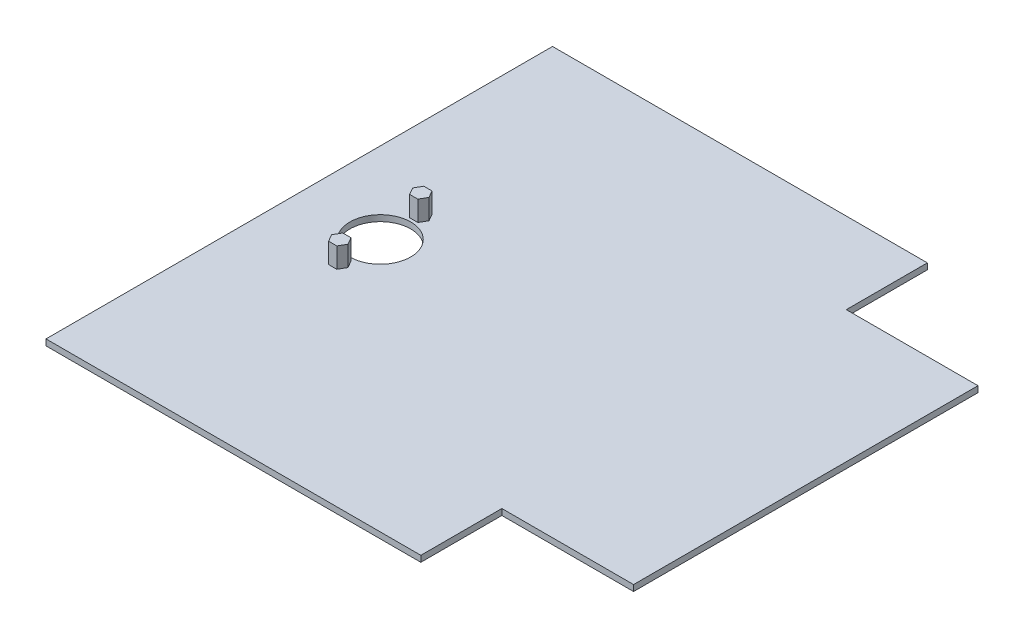
ISO-10303-21;
HEADER;
FILE_DESCRIPTION(('STEP AP214'),'2;1');
FILE_NAME('part.step','',(''),(''),'','','');
FILE_SCHEMA(('AUTOMOTIVE_DESIGN { 1 0 10303 214 1 1 1 1 }'));
ENDSEC;
DATA;
#1=APPLICATION_CONTEXT('core data for automotive mechanical design processes');
#2=APPLICATION_PROTOCOL_DEFINITION('international standard','automotive_design',2000,#1);
#3=PRODUCT_CONTEXT('',#1,'mechanical');
#4=PRODUCT('Part','Part','',(#3));
#5=PRODUCT_RELATED_PRODUCT_CATEGORY('part','',(#4));
#6=PRODUCT_DEFINITION_FORMATION('','',#4);
#7=PRODUCT_DEFINITION_CONTEXT('part definition',#1,'design');
#8=PRODUCT_DEFINITION('design','',#6,#7);
#9=PRODUCT_DEFINITION_SHAPE('','',#8);
#10=(LENGTH_UNIT() NAMED_UNIT(*) SI_UNIT(.MILLI.,.METRE.));
#11=(NAMED_UNIT(*) PLANE_ANGLE_UNIT() SI_UNIT($,.RADIAN.));
#12=(NAMED_UNIT(*) SI_UNIT($,.STERADIAN.) SOLID_ANGLE_UNIT());
#13=UNCERTAINTY_MEASURE_WITH_UNIT(LENGTH_MEASURE(1.E-05),#10,'distance_accuracy_value','');
#14=(GEOMETRIC_REPRESENTATION_CONTEXT(3) GLOBAL_UNCERTAINTY_ASSIGNED_CONTEXT((#13)) GLOBAL_UNIT_ASSIGNED_CONTEXT((#10,
#11,#12)) REPRESENTATION_CONTEXT('',''));
#15=CARTESIAN_POINT('',(0.,0.,0.));
#16=DIRECTION('',(0.,0.,1.));
#17=DIRECTION('',(1.,0.,0.));
#18=AXIS2_PLACEMENT_3D('',#15,#16,#17);
#19=CARTESIAN_POINT('',(0.,3.,0.));
#20=DIRECTION('',(0.,-1.,0.));
#21=DIRECTION('',(0.,0.,-1.));
#22=AXIS2_PLACEMENT_3D('',#19,#20,#21);
#23=PLANE('',#22);
#24=DIRECTION('',(0.499999999999999,0.,-0.866025403784439));
#25=VECTOR('',#24,1.);
#26=CARTESIAN_POINT('',(42.0207259421637,3.,-141.5));
#27=LINE('',#26,#25);
#28=CARTESIAN_POINT('',(42.0207259421637,3.,-141.5));
#29=VERTEX_POINT('',#28);
#30=CARTESIAN_POINT('',(44.0414518843274,3.,-145.));
#31=VERTEX_POINT('',#30);
#32=EDGE_CURVE('E191',#29,#31,#27,.T.);
#33=ORIENTED_EDGE('',*,*,#32,.F.);
#34=DIRECTION('',(1.,0.,0.));
#35=VECTOR('',#34,1.);
#36=CARTESIAN_POINT('',(37.9792740578363,3.,-141.5));
#37=LINE('',#36,#35);
#38=CARTESIAN_POINT('',(37.9792740578363,3.,-141.5));
#39=VERTEX_POINT('',#38);
#40=EDGE_CURVE('E204',#39,#29,#37,.T.);
#41=ORIENTED_EDGE('',*,*,#40,.F.);
#42=DIRECTION('',(0.499999999999999,0.,0.86602540378444));
#43=VECTOR('',#42,1.);
#44=CARTESIAN_POINT('',(35.9585481156726,3.,-145.));
#45=LINE('',#44,#43);
#46=CARTESIAN_POINT('',(35.9585481156726,3.,-145.));
#47=VERTEX_POINT('',#46);
#48=EDGE_CURVE('E223',#47,#39,#45,.T.);
#49=ORIENTED_EDGE('',*,*,#48,.F.);
#50=DIRECTION('',(-0.500000000000002,0.,0.866025403784438));
#51=VECTOR('',#50,1.);
#52=CARTESIAN_POINT('',(37.9792740578363,3.,-148.5));
#53=LINE('',#52,#51);
#54=CARTESIAN_POINT('',(37.9792740578363,3.,-148.5));
#55=VERTEX_POINT('',#54);
#56=EDGE_CURVE('E220',#55,#47,#53,.T.);
#57=ORIENTED_EDGE('',*,*,#56,.F.);
#58=DIRECTION('',(-1.,0.,0.));
#59=VECTOR('',#58,1.);
#60=CARTESIAN_POINT('',(42.0207259421637,3.,-148.5));
#61=LINE('',#60,#59);
#62=CARTESIAN_POINT('',(42.0207259421637,3.,-148.5));
#63=VERTEX_POINT('',#62);
#64=EDGE_CURVE('E217',#63,#55,#61,.T.);
#65=ORIENTED_EDGE('',*,*,#64,.F.);
#66=DIRECTION('',(-0.500000000000001,0.,-0.866025403784438));
#67=VECTOR('',#66,1.);
#68=CARTESIAN_POINT('',(44.0414518843274,3.,-145.));
#69=LINE('',#68,#67);
#70=EDGE_CURVE('E194',#31,#63,#69,.T.);
#71=ORIENTED_EDGE('',*,*,#70,.F.);
#72=EDGE_LOOP('',(#33,#41,#49,#57,#65,#71));
#73=FACE_BOUND('',#72,.T.);
#74=DIRECTION('',(0.,0.,1.));
#75=VECTOR('',#74,1.);
#76=CARTESIAN_POINT('',(0.,3.,0.));
#77=LINE('',#76,#75);
#78=CARTESIAN_POINT('',(0.,3.,-250.));
#79=VERTEX_POINT('',#78);
#80=CARTESIAN_POINT('',(0.,3.,0.));
#81=VERTEX_POINT('',#80);
#82=EDGE_CURVE('E252',#79,#81,#77,.T.);
#83=ORIENTED_EDGE('',*,*,#82,.T.);
#84=DIRECTION('',(1.,0.,0.));
#85=VECTOR('',#84,1.);
#86=CARTESIAN_POINT('',(0.,3.,0.));
#87=LINE('',#86,#85);
#88=CARTESIAN_POINT('',(185.,3.,0.));
#89=VERTEX_POINT('',#88);
#90=EDGE_CURVE('E255',#81,#89,#87,.T.);
#91=ORIENTED_EDGE('',*,*,#90,.T.);
#92=DIRECTION('',(0.,0.,-1.));
#93=VECTOR('',#92,1.);
#94=CARTESIAN_POINT('',(185.,3.,0.));
#95=LINE('',#94,#93);
#96=CARTESIAN_POINT('',(185.,3.,-40.));
#97=VERTEX_POINT('',#96);
#98=EDGE_CURVE('E258',#89,#97,#95,.T.);
#99=ORIENTED_EDGE('',*,*,#98,.T.);
#100=DIRECTION('',(1.,0.,0.));
#101=VECTOR('',#100,1.);
#102=CARTESIAN_POINT('',(185.,3.,-40.));
#103=LINE('',#102,#101);
#104=CARTESIAN_POINT('',(250.,3.,-40.));
#105=VERTEX_POINT('',#104);
#106=EDGE_CURVE('E260',#97,#105,#103,.T.);
#107=ORIENTED_EDGE('',*,*,#106,.T.);
#108=DIRECTION('',(0.,0.,-1.));
#109=VECTOR('',#108,1.);
#110=CARTESIAN_POINT('',(250.,3.,-40.));
#111=LINE('',#110,#109);
#112=CARTESIAN_POINT('',(250.,3.,-210.));
#113=VERTEX_POINT('',#112);
#114=EDGE_CURVE('E262',#105,#113,#111,.T.);
#115=ORIENTED_EDGE('',*,*,#114,.T.);
#116=DIRECTION('',(-1.,0.,0.));
#117=VECTOR('',#116,1.);
#118=CARTESIAN_POINT('',(250.,3.,-210.));
#119=LINE('',#118,#117);
#120=CARTESIAN_POINT('',(185.,3.,-210.));
#121=VERTEX_POINT('',#120);
#122=EDGE_CURVE('E264',#113,#121,#119,.T.);
#123=ORIENTED_EDGE('',*,*,#122,.T.);
#124=DIRECTION('',(0.,0.,-1.));
#125=VECTOR('',#124,1.);
#126=CARTESIAN_POINT('',(185.,3.,-250.));
#127=LINE('',#126,#125);
#128=CARTESIAN_POINT('',(185.,3.,-250.));
#129=VERTEX_POINT('',#128);
#130=EDGE_CURVE('E266',#121,#129,#127,.T.);
#131=ORIENTED_EDGE('',*,*,#130,.T.);
#132=DIRECTION('',(-1.,0.,0.));
#133=VECTOR('',#132,1.);
#134=CARTESIAN_POINT('',(0.,3.,-250.));
#135=LINE('',#134,#133);
#136=EDGE_CURVE('E268',#129,#79,#135,.T.);
#137=ORIENTED_EDGE('',*,*,#136,.T.);
#138=EDGE_LOOP('',(#83,#91,#99,#107,#115,#123,#131,#137));
#139=FACE_BOUND('',#138,.T.);
#140=CARTESIAN_POINT('',(40.,3.,-125.));
#141=DIRECTION('',(0.,1.,0.));
#142=DIRECTION('',(0.,0.,1.));
#143=AXIS2_PLACEMENT_3D('',#140,#141,#142);
#144=CIRCLE('',#143,15.);
#145=CARTESIAN_POINT('',(40.,3.,-110.));
#146=VERTEX_POINT('',#145);
#147=EDGE_CURVE('E246',#146,#146,#144,.T.);
#148=ORIENTED_EDGE('',*,*,#147,.F.);
#149=EDGE_LOOP('',(#148));
#150=FACE_BOUND('',#149,.T.);
#151=DIRECTION('',(0.500000000000001,0.,-0.866025403784438));
#152=VECTOR('',#151,1.);
#153=CARTESIAN_POINT('',(42.0207259421637,3.,-101.5));
#154=LINE('',#153,#152);
#155=CARTESIAN_POINT('',(42.0207259421637,3.,-101.5));
#156=VERTEX_POINT('',#155);
#157=CARTESIAN_POINT('',(44.0414518843274,3.,-105.));
#158=VERTEX_POINT('',#157);
#159=EDGE_CURVE('E190',#156,#158,#154,.T.);
#160=ORIENTED_EDGE('',*,*,#159,.F.);
#161=DIRECTION('',(1.,0.,0.));
#162=VECTOR('',#161,1.);
#163=CARTESIAN_POINT('',(37.9792740578364,3.,-101.5));
#164=LINE('',#163,#162);
#165=CARTESIAN_POINT('',(37.9792740578364,3.,-101.5));
#166=VERTEX_POINT('',#165);
#167=EDGE_CURVE('E187',#166,#156,#164,.T.);
#168=ORIENTED_EDGE('',*,*,#167,.F.);
#169=DIRECTION('',(0.5,0.,0.866025403784439));
#170=VECTOR('',#169,1.);
#171=CARTESIAN_POINT('',(35.9585481156727,3.,-105.));
#172=LINE('',#171,#170);
#173=CARTESIAN_POINT('',(35.9585481156727,3.,-105.));
#174=VERTEX_POINT('',#173);
#175=EDGE_CURVE('E387',#174,#166,#172,.T.);
#176=ORIENTED_EDGE('',*,*,#175,.F.);
#177=DIRECTION('',(-0.499999999999999,0.,0.866025403784439));
#178=VECTOR('',#177,1.);
#179=CARTESIAN_POINT('',(37.9792740578364,3.,-108.5));
#180=LINE('',#179,#178);
#181=CARTESIAN_POINT('',(37.9792740578364,3.,-108.5));
#182=VERTEX_POINT('',#181);
#183=EDGE_CURVE('E404',#182,#174,#180,.T.);
#184=ORIENTED_EDGE('',*,*,#183,.F.);
#185=DIRECTION('',(-1.,0.,0.));
#186=VECTOR('',#185,1.);
#187=CARTESIAN_POINT('',(42.0207259421637,3.,-108.5));
#188=LINE('',#187,#186);
#189=CARTESIAN_POINT('',(42.0207259421637,3.,-108.5));
#190=VERTEX_POINT('',#189);
#191=EDGE_CURVE('E53',#190,#182,#188,.T.);
#192=ORIENTED_EDGE('',*,*,#191,.F.);
#193=DIRECTION('',(-0.499999999999999,0.,-0.866025403784439));
#194=VECTOR('',#193,1.);
#195=CARTESIAN_POINT('',(44.0414518843274,3.,-105.));
#196=LINE('',#195,#194);
#197=EDGE_CURVE('E48',#158,#190,#196,.T.);
#198=ORIENTED_EDGE('',*,*,#197,.F.);
#199=EDGE_LOOP('',(#160,#168,#176,#184,#192,#198));
#200=FACE_BOUND('',#199,.T.);
#201=ADVANCED_FACE('F33',(#73,#139,#150,#200),#23,.F.);
#202=CARTESIAN_POINT('',(0.,0.,0.));
#203=DIRECTION('',(0.,-1.,0.));
#204=DIRECTION('',(0.,0.,-1.));
#205=AXIS2_PLACEMENT_3D('',#202,#203,#204);
#206=PLANE('',#205);
#207=DIRECTION('',(0.,0.,1.));
#208=VECTOR('',#207,1.);
#209=CARTESIAN_POINT('',(0.,0.,0.));
#210=LINE('',#209,#208);
#211=CARTESIAN_POINT('',(0.,0.,-250.));
#212=VERTEX_POINT('',#211);
#213=CARTESIAN_POINT('',(0.,0.,0.));
#214=VERTEX_POINT('',#213);
#215=EDGE_CURVE('E249',#212,#214,#210,.T.);
#216=ORIENTED_EDGE('',*,*,#215,.F.);
#217=DIRECTION('',(-1.,0.,0.));
#218=VECTOR('',#217,1.);
#219=CARTESIAN_POINT('',(0.,0.,-250.));
#220=LINE('',#219,#218);
#221=CARTESIAN_POINT('',(185.,0.,-250.));
#222=VERTEX_POINT('',#221);
#223=EDGE_CURVE('E256',#222,#212,#220,.T.);
#224=ORIENTED_EDGE('',*,*,#223,.F.);
#225=DIRECTION('',(0.,0.,-1.));
#226=VECTOR('',#225,1.);
#227=CARTESIAN_POINT('',(185.,0.,-250.));
#228=LINE('',#227,#226);
#229=CARTESIAN_POINT('',(185.,0.,-210.));
#230=VERTEX_POINT('',#229);
#231=EDGE_CURVE('E283',#230,#222,#228,.T.);
#232=ORIENTED_EDGE('',*,*,#231,.F.);
#233=DIRECTION('',(-1.,0.,0.));
#234=VECTOR('',#233,1.);
#235=CARTESIAN_POINT('',(250.,0.,-210.));
#236=LINE('',#235,#234);
#237=CARTESIAN_POINT('',(250.,0.,-210.));
#238=VERTEX_POINT('',#237);
#239=EDGE_CURVE('E281',#238,#230,#236,.T.);
#240=ORIENTED_EDGE('',*,*,#239,.F.);
#241=DIRECTION('',(0.,0.,-1.));
#242=VECTOR('',#241,1.);
#243=CARTESIAN_POINT('',(250.,0.,-40.));
#244=LINE('',#243,#242);
#245=CARTESIAN_POINT('',(250.,0.,-40.));
#246=VERTEX_POINT('',#245);
#247=EDGE_CURVE('E279',#246,#238,#244,.T.);
#248=ORIENTED_EDGE('',*,*,#247,.F.);
#249=DIRECTION('',(1.,0.,0.));
#250=VECTOR('',#249,1.);
#251=CARTESIAN_POINT('',(185.,0.,-40.));
#252=LINE('',#251,#250);
#253=CARTESIAN_POINT('',(185.,0.,-40.));
#254=VERTEX_POINT('',#253);
#255=EDGE_CURVE('E277',#254,#246,#252,.T.);
#256=ORIENTED_EDGE('',*,*,#255,.F.);
#257=DIRECTION('',(0.,0.,-1.));
#258=VECTOR('',#257,1.);
#259=CARTESIAN_POINT('',(185.,0.,0.));
#260=LINE('',#259,#258);
#261=CARTESIAN_POINT('',(185.,0.,0.));
#262=VERTEX_POINT('',#261);
#263=EDGE_CURVE('E275',#262,#254,#260,.T.);
#264=ORIENTED_EDGE('',*,*,#263,.F.);
#265=DIRECTION('',(1.,0.,0.));
#266=VECTOR('',#265,1.);
#267=CARTESIAN_POINT('',(0.,0.,0.));
#268=LINE('',#267,#266);
#269=EDGE_CURVE('E273',#214,#262,#268,.T.);
#270=ORIENTED_EDGE('',*,*,#269,.F.);
#271=EDGE_LOOP('',(#216,#224,#232,#240,#248,#256,#264,#270));
#272=FACE_BOUND('',#271,.T.);
#273=CARTESIAN_POINT('',(40.,0.,-125.));
#274=DIRECTION('',(0.,1.,0.));
#275=DIRECTION('',(0.,0.,1.));
#276=AXIS2_PLACEMENT_3D('',#273,#274,#275);
#277=CIRCLE('',#276,15.);
#278=CARTESIAN_POINT('',(40.,0.,-110.));
#279=VERTEX_POINT('',#278);
#280=EDGE_CURVE('E245',#279,#279,#277,.T.);
#281=ORIENTED_EDGE('',*,*,#280,.T.);
#282=EDGE_LOOP('',(#281));
#283=FACE_BOUND('',#282,.T.);
#284=ADVANCED_FACE('F313',(#272,#283),#206,.T.);
#285=CARTESIAN_POINT('',(0.,3.,0.));
#286=DIRECTION('',(1.,0.,0.));
#287=DIRECTION('',(0.,0.,-1.));
#288=AXIS2_PLACEMENT_3D('',#285,#286,#287);
#289=PLANE('',#288);
#290=ORIENTED_EDGE('',*,*,#215,.T.);
#291=DIRECTION('',(0.,-1.,0.));
#292=VECTOR('',#291,1.);
#293=CARTESIAN_POINT('',(0.,3.,0.));
#294=LINE('',#293,#292);
#295=EDGE_CURVE('E11',#81,#214,#294,.T.);
#296=ORIENTED_EDGE('',*,*,#295,.F.);
#297=ORIENTED_EDGE('',*,*,#82,.F.);
#298=DIRECTION('',(0.,-1.,0.));
#299=VECTOR('',#298,1.);
#300=CARTESIAN_POINT('',(0.,3.,-250.));
#301=LINE('',#300,#299);
#302=EDGE_CURVE('E270',#79,#212,#301,.T.);
#303=ORIENTED_EDGE('',*,*,#302,.T.);
#304=EDGE_LOOP('',(#290,#296,#297,#303));
#305=FACE_BOUND('',#304,.T.);
#306=ADVANCED_FACE('F35',(#305),#289,.F.);
#307=CARTESIAN_POINT('',(0.,3.,0.));
#308=DIRECTION('',(0.,0.,-1.));
#309=DIRECTION('',(-1.,0.,0.));
#310=AXIS2_PLACEMENT_3D('',#307,#308,#309);
#311=PLANE('',#310);
#312=ORIENTED_EDGE('',*,*,#269,.T.);
#313=DIRECTION('',(0.,-1.,0.));
#314=VECTOR('',#313,1.);
#315=CARTESIAN_POINT('',(185.,3.,0.));
#316=LINE('',#315,#314);
#317=EDGE_CURVE('E41',#89,#262,#316,.T.);
#318=ORIENTED_EDGE('',*,*,#317,.F.);
#319=ORIENTED_EDGE('',*,*,#90,.F.);
#320=ORIENTED_EDGE('',*,*,#295,.T.);
#321=EDGE_LOOP('',(#312,#318,#319,#320));
#322=FACE_BOUND('',#321,.T.);
#323=ADVANCED_FACE('F331',(#322),#311,.F.);
#324=CARTESIAN_POINT('',(185.,3.,0.));
#325=DIRECTION('',(-1.,0.,0.));
#326=DIRECTION('',(0.,0.,1.));
#327=AXIS2_PLACEMENT_3D('',#324,#325,#326);
#328=PLANE('',#327);
#329=ORIENTED_EDGE('',*,*,#263,.T.);
#330=DIRECTION('',(0.,-1.,0.));
#331=VECTOR('',#330,1.);
#332=CARTESIAN_POINT('',(185.,3.,-40.));
#333=LINE('',#332,#331);
#334=EDGE_CURVE('E300',#97,#254,#333,.T.);
#335=ORIENTED_EDGE('',*,*,#334,.F.);
#336=ORIENTED_EDGE('',*,*,#98,.F.);
#337=ORIENTED_EDGE('',*,*,#317,.T.);
#338=EDGE_LOOP('',(#329,#335,#336,#337));
#339=FACE_BOUND('',#338,.T.);
#340=ADVANCED_FACE('F307',(#339),#328,.F.);
#341=CARTESIAN_POINT('',(185.,3.,-40.));
#342=DIRECTION('',(0.,0.,-1.));
#343=DIRECTION('',(-1.,0.,0.));
#344=AXIS2_PLACEMENT_3D('',#341,#342,#343);
#345=PLANE('',#344);
#346=ORIENTED_EDGE('',*,*,#255,.T.);
#347=DIRECTION('',(0.,-1.,0.));
#348=VECTOR('',#347,1.);
#349=CARTESIAN_POINT('',(250.,3.,-40.));
#350=LINE('',#349,#348);
#351=EDGE_CURVE('E297',#105,#246,#350,.T.);
#352=ORIENTED_EDGE('',*,*,#351,.F.);
#353=ORIENTED_EDGE('',*,*,#106,.F.);
#354=ORIENTED_EDGE('',*,*,#334,.T.);
#355=EDGE_LOOP('',(#346,#352,#353,#354));
#356=FACE_BOUND('',#355,.T.);
#357=ADVANCED_FACE('F319',(#356),#345,.F.);
#358=CARTESIAN_POINT('',(250.,3.,-40.));
#359=DIRECTION('',(-1.,0.,0.));
#360=DIRECTION('',(0.,0.,1.));
#361=AXIS2_PLACEMENT_3D('',#358,#359,#360);
#362=PLANE('',#361);
#363=ORIENTED_EDGE('',*,*,#247,.T.);
#364=DIRECTION('',(0.,-1.,0.));
#365=VECTOR('',#364,1.);
#366=CARTESIAN_POINT('',(250.,3.,-210.));
#367=LINE('',#366,#365);
#368=EDGE_CURVE('E294',#113,#238,#367,.T.);
#369=ORIENTED_EDGE('',*,*,#368,.F.);
#370=ORIENTED_EDGE('',*,*,#114,.F.);
#371=ORIENTED_EDGE('',*,*,#351,.T.);
#372=EDGE_LOOP('',(#363,#369,#370,#371));
#373=FACE_BOUND('',#372,.T.);
#374=ADVANCED_FACE('F323',(#373),#362,.F.);
#375=CARTESIAN_POINT('',(250.,3.,-210.));
#376=DIRECTION('',(0.,0.,1.));
#377=DIRECTION('',(1.,0.,0.));
#378=AXIS2_PLACEMENT_3D('',#375,#376,#377);
#379=PLANE('',#378);
#380=ORIENTED_EDGE('',*,*,#239,.T.);
#381=DIRECTION('',(0.,-1.,0.));
#382=VECTOR('',#381,1.);
#383=CARTESIAN_POINT('',(185.,3.,-210.));
#384=LINE('',#383,#382);
#385=EDGE_CURVE('E291',#121,#230,#384,.T.);
#386=ORIENTED_EDGE('',*,*,#385,.F.);
#387=ORIENTED_EDGE('',*,*,#122,.F.);
#388=ORIENTED_EDGE('',*,*,#368,.T.);
#389=EDGE_LOOP('',(#380,#386,#387,#388));
#390=FACE_BOUND('',#389,.T.);
#391=ADVANCED_FACE('F344',(#390),#379,.F.);
#392=CARTESIAN_POINT('',(185.,3.,-250.));
#393=DIRECTION('',(-1.,0.,0.));
#394=DIRECTION('',(0.,0.,1.));
#395=AXIS2_PLACEMENT_3D('',#392,#393,#394);
#396=PLANE('',#395);
#397=ORIENTED_EDGE('',*,*,#231,.T.);
#398=DIRECTION('',(0.,-1.,0.));
#399=VECTOR('',#398,1.);
#400=CARTESIAN_POINT('',(185.,3.,-250.));
#401=LINE('',#400,#399);
#402=EDGE_CURVE('E288',#129,#222,#401,.T.);
#403=ORIENTED_EDGE('',*,*,#402,.F.);
#404=ORIENTED_EDGE('',*,*,#130,.F.);
#405=ORIENTED_EDGE('',*,*,#385,.T.);
#406=EDGE_LOOP('',(#397,#403,#404,#405));
#407=FACE_BOUND('',#406,.T.);
#408=ADVANCED_FACE('F342',(#407),#396,.F.);
#409=CARTESIAN_POINT('',(0.,3.,-250.));
#410=DIRECTION('',(0.,0.,1.));
#411=DIRECTION('',(1.,0.,0.));
#412=AXIS2_PLACEMENT_3D('',#409,#410,#411);
#413=PLANE('',#412);
#414=ORIENTED_EDGE('',*,*,#223,.T.);
#415=ORIENTED_EDGE('',*,*,#302,.F.);
#416=ORIENTED_EDGE('',*,*,#136,.F.);
#417=ORIENTED_EDGE('',*,*,#402,.T.);
#418=EDGE_LOOP('',(#414,#415,#416,#417));
#419=FACE_BOUND('',#418,.T.);
#420=ADVANCED_FACE('F337',(#419),#413,.F.);
#421=CARTESIAN_POINT('',(40.,3.,-125.));
#422=DIRECTION('',(0.,-1.,0.));
#423=DIRECTION('',(0.,0.,-1.));
#424=AXIS2_PLACEMENT_3D('',#421,#422,#423);
#425=CYLINDRICAL_SURFACE('',#424,15.);
#426=ORIENTED_EDGE('',*,*,#147,.T.);
#427=EDGE_LOOP('',(#426));
#428=FACE_BOUND('',#427,.T.);
#429=ORIENTED_EDGE('',*,*,#280,.F.);
#430=EDGE_LOOP('',(#429));
#431=FACE_BOUND('',#430,.T.);
#432=ADVANCED_FACE('F361',(#428,#431),#425,.F.);
#433=CARTESIAN_POINT('',(42.0207259421637,13.,-141.5));
#434=DIRECTION('',(-0.866025403784439,0.,-0.499999999999999));
#435=DIRECTION('',(-0.499999999999999,0.,0.866025403784439));
#436=AXIS2_PLACEMENT_3D('',#433,#434,#435);
#437=PLANE('',#436);
#438=ORIENTED_EDGE('',*,*,#32,.T.);
#439=DIRECTION('',(0.,-1.,0.));
#440=VECTOR('',#439,1.);
#441=CARTESIAN_POINT('',(44.0414518843274,13.,-145.));
#442=LINE('',#441,#440);
#443=CARTESIAN_POINT('',(44.0414518843274,13.,-145.));
#444=VERTEX_POINT('',#443);
#445=EDGE_CURVE('E242',#444,#31,#442,.T.);
#446=ORIENTED_EDGE('',*,*,#445,.F.);
#447=DIRECTION('',(0.499999999999999,0.,-0.866025403784439));
#448=VECTOR('',#447,1.);
#449=CARTESIAN_POINT('',(42.0207259421637,13.,-141.5));
#450=LINE('',#449,#448);
#451=CARTESIAN_POINT('',(42.0207259421637,13.,-141.5));
#452=VERTEX_POINT('',#451);
#453=EDGE_CURVE('E200',#452,#444,#450,.T.);
#454=ORIENTED_EDGE('',*,*,#453,.F.);
#455=DIRECTION('',(0.,-1.,0.));
#456=VECTOR('',#455,1.);
#457=CARTESIAN_POINT('',(42.0207259421637,13.,-141.5));
#458=LINE('',#457,#456);
#459=EDGE_CURVE('E213',#452,#29,#458,.T.);
#460=ORIENTED_EDGE('',*,*,#459,.T.);
#461=EDGE_LOOP('',(#438,#446,#454,#460));
#462=FACE_BOUND('',#461,.T.);
#463=ADVANCED_FACE('F368',(#462),#437,.F.);
#464=CARTESIAN_POINT('',(44.0414518843274,13.,-145.));
#465=DIRECTION('',(-0.866025403784438,0.,0.500000000000001));
#466=DIRECTION('',(0.500000000000001,0.,0.866025403784438));
#467=AXIS2_PLACEMENT_3D('',#464,#465,#466);
#468=PLANE('',#467);
#469=ORIENTED_EDGE('',*,*,#70,.T.);
#470=DIRECTION('',(0.,-1.,0.));
#471=VECTOR('',#470,1.);
#472=CARTESIAN_POINT('',(42.0207259421637,13.,-148.5));
#473=LINE('',#472,#471);
#474=CARTESIAN_POINT('',(42.0207259421637,13.,-148.5));
#475=VERTEX_POINT('',#474);
#476=EDGE_CURVE('E239',#475,#63,#473,.T.);
#477=ORIENTED_EDGE('',*,*,#476,.F.);
#478=DIRECTION('',(-0.500000000000001,0.,-0.866025403784438));
#479=VECTOR('',#478,1.);
#480=CARTESIAN_POINT('',(44.0414518843274,13.,-145.));
#481=LINE('',#480,#479);
#482=EDGE_CURVE('E203',#444,#475,#481,.T.);
#483=ORIENTED_EDGE('',*,*,#482,.F.);
#484=ORIENTED_EDGE('',*,*,#445,.T.);
#485=EDGE_LOOP('',(#469,#477,#483,#484));
#486=FACE_BOUND('',#485,.T.);
#487=ADVANCED_FACE('F373',(#486),#468,.F.);
#488=CARTESIAN_POINT('',(42.0207259421637,13.,-148.5));
#489=DIRECTION('',(0.,0.,1.));
#490=DIRECTION('',(1.,0.,0.));
#491=AXIS2_PLACEMENT_3D('',#488,#489,#490);
#492=PLANE('',#491);
#493=ORIENTED_EDGE('',*,*,#64,.T.);
#494=DIRECTION('',(0.,-1.,0.));
#495=VECTOR('',#494,1.);
#496=CARTESIAN_POINT('',(37.9792740578363,13.,-148.5));
#497=LINE('',#496,#495);
#498=CARTESIAN_POINT('',(37.9792740578363,13.,-148.5));
#499=VERTEX_POINT('',#498);
#500=EDGE_CURVE('E236',#499,#55,#497,.T.);
#501=ORIENTED_EDGE('',*,*,#500,.F.);
#502=DIRECTION('',(-1.,0.,0.));
#503=VECTOR('',#502,1.);
#504=CARTESIAN_POINT('',(42.0207259421637,13.,-148.5));
#505=LINE('',#504,#503);
#506=EDGE_CURVE('E206',#475,#499,#505,.T.);
#507=ORIENTED_EDGE('',*,*,#506,.F.);
#508=ORIENTED_EDGE('',*,*,#476,.T.);
#509=EDGE_LOOP('',(#493,#501,#507,#508));
#510=FACE_BOUND('',#509,.T.);
#511=ADVANCED_FACE('F448',(#510),#492,.F.);
#512=CARTESIAN_POINT('',(37.9792740578363,13.,-148.5));
#513=DIRECTION('',(0.866025403784438,0.,0.500000000000002));
#514=DIRECTION('',(0.500000000000002,0.,-0.866025403784438));
#515=AXIS2_PLACEMENT_3D('',#512,#513,#514);
#516=PLANE('',#515);
#517=ORIENTED_EDGE('',*,*,#56,.T.);
#518=DIRECTION('',(0.,-1.,0.));
#519=VECTOR('',#518,1.);
#520=CARTESIAN_POINT('',(35.9585481156726,13.,-145.));
#521=LINE('',#520,#519);
#522=CARTESIAN_POINT('',(35.9585481156726,13.,-145.));
#523=VERTEX_POINT('',#522);
#524=EDGE_CURVE('E233',#523,#47,#521,.T.);
#525=ORIENTED_EDGE('',*,*,#524,.F.);
#526=DIRECTION('',(-0.500000000000002,0.,0.866025403784438));
#527=VECTOR('',#526,1.);
#528=CARTESIAN_POINT('',(37.9792740578363,13.,-148.5));
#529=LINE('',#528,#527);
#530=EDGE_CURVE('E208',#499,#523,#529,.T.);
#531=ORIENTED_EDGE('',*,*,#530,.F.);
#532=ORIENTED_EDGE('',*,*,#500,.T.);
#533=EDGE_LOOP('',(#517,#525,#531,#532));
#534=FACE_BOUND('',#533,.T.);
#535=ADVANCED_FACE('F444',(#534),#516,.F.);
#536=CARTESIAN_POINT('',(35.9585481156726,13.,-145.));
#537=DIRECTION('',(0.86602540378444,0.,-0.499999999999998));
#538=DIRECTION('',(-0.499999999999998,0.,-0.86602540378444));
#539=AXIS2_PLACEMENT_3D('',#536,#537,#538);
#540=PLANE('',#539);
#541=ORIENTED_EDGE('',*,*,#48,.T.);
#542=DIRECTION('',(0.,-1.,0.));
#543=VECTOR('',#542,1.);
#544=CARTESIAN_POINT('',(37.9792740578363,13.,-141.5));
#545=LINE('',#544,#543);
#546=CARTESIAN_POINT('',(37.9792740578363,13.,-141.5));
#547=VERTEX_POINT('',#546);
#548=EDGE_CURVE('E230',#547,#39,#545,.T.);
#549=ORIENTED_EDGE('',*,*,#548,.F.);
#550=DIRECTION('',(0.499999999999999,0.,0.86602540378444));
#551=VECTOR('',#550,1.);
#552=CARTESIAN_POINT('',(35.9585481156726,13.,-145.));
#553=LINE('',#552,#551);
#554=EDGE_CURVE('E210',#523,#547,#553,.T.);
#555=ORIENTED_EDGE('',*,*,#554,.F.);
#556=ORIENTED_EDGE('',*,*,#524,.T.);
#557=EDGE_LOOP('',(#541,#549,#555,#556));
#558=FACE_BOUND('',#557,.T.);
#559=ADVANCED_FACE('F440',(#558),#540,.F.);
#560=CARTESIAN_POINT('',(37.9792740578363,13.,-141.5));
#561=DIRECTION('',(0.,0.,-1.));
#562=DIRECTION('',(-1.,0.,0.));
#563=AXIS2_PLACEMENT_3D('',#560,#561,#562);
#564=PLANE('',#563);
#565=ORIENTED_EDGE('',*,*,#40,.T.);
#566=ORIENTED_EDGE('',*,*,#459,.F.);
#567=DIRECTION('',(1.,0.,0.));
#568=VECTOR('',#567,1.);
#569=CARTESIAN_POINT('',(37.9792740578363,13.,-141.5));
#570=LINE('',#569,#568);
#571=EDGE_CURVE('E212',#547,#452,#570,.T.);
#572=ORIENTED_EDGE('',*,*,#571,.F.);
#573=ORIENTED_EDGE('',*,*,#548,.T.);
#574=EDGE_LOOP('',(#565,#566,#572,#573));
#575=FACE_BOUND('',#574,.T.);
#576=ADVANCED_FACE('F436',(#575),#564,.F.);
#577=CARTESIAN_POINT('',(0.,13.,0.));
#578=DIRECTION('',(0.,1.,0.));
#579=DIRECTION('',(0.,0.,1.));
#580=AXIS2_PLACEMENT_3D('',#577,#578,#579);
#581=PLANE('',#580);
#582=ORIENTED_EDGE('',*,*,#453,.T.);
#583=ORIENTED_EDGE('',*,*,#482,.T.);
#584=ORIENTED_EDGE('',*,*,#506,.T.);
#585=ORIENTED_EDGE('',*,*,#530,.T.);
#586=ORIENTED_EDGE('',*,*,#554,.T.);
#587=ORIENTED_EDGE('',*,*,#571,.T.);
#588=EDGE_LOOP('',(#582,#583,#584,#585,#586,#587));
#589=FACE_BOUND('',#588,.T.);
#590=ADVANCED_FACE('F433',(#589),#581,.T.);
#591=CARTESIAN_POINT('',(42.0207259421637,13.,-101.5));
#592=DIRECTION('',(-0.866025403784438,0.,-0.500000000000001));
#593=DIRECTION('',(-0.500000000000001,0.,0.866025403784438));
#594=AXIS2_PLACEMENT_3D('',#591,#592,#593);
#595=PLANE('',#594);
#596=ORIENTED_EDGE('',*,*,#159,.T.);
#597=DIRECTION('',(0.,-1.,0.));
#598=VECTOR('',#597,1.);
#599=CARTESIAN_POINT('',(44.0414518843274,13.,-105.));
#600=LINE('',#599,#598);
#601=CARTESIAN_POINT('',(44.0414518843274,13.,-105.));
#602=VERTEX_POINT('',#601);
#603=EDGE_CURVE('E171',#602,#158,#600,.T.);
#604=ORIENTED_EDGE('',*,*,#603,.F.);
#605=DIRECTION('',(0.500000000000001,0.,-0.866025403784438));
#606=VECTOR('',#605,1.);
#607=CARTESIAN_POINT('',(42.0207259421637,13.,-101.5));
#608=LINE('',#607,#606);
#609=CARTESIAN_POINT('',(42.0207259421637,13.,-101.5));
#610=VERTEX_POINT('',#609);
#611=EDGE_CURVE('E178',#610,#602,#608,.T.);
#612=ORIENTED_EDGE('',*,*,#611,.F.);
#613=DIRECTION('',(0.,-1.,0.));
#614=VECTOR('',#613,1.);
#615=CARTESIAN_POINT('',(42.0207259421637,13.,-101.5));
#616=LINE('',#615,#614);
#617=EDGE_CURVE('E384',#610,#156,#616,.T.);
#618=ORIENTED_EDGE('',*,*,#617,.T.);
#619=EDGE_LOOP('',(#596,#604,#612,#618));
#620=FACE_BOUND('',#619,.T.);
#621=ADVANCED_FACE('F189',(#620),#595,.F.);
#622=CARTESIAN_POINT('',(44.0414518843274,13.,-105.));
#623=DIRECTION('',(-0.866025403784439,0.,0.499999999999999));
#624=DIRECTION('',(0.499999999999999,0.,0.866025403784439));
#625=AXIS2_PLACEMENT_3D('',#622,#623,#624);
#626=PLANE('',#625);
#627=ORIENTED_EDGE('',*,*,#197,.T.);
#628=DIRECTION('',(0.,-1.,0.));
#629=VECTOR('',#628,1.);
#630=CARTESIAN_POINT('',(42.0207259421637,13.,-108.5));
#631=LINE('',#630,#629);
#632=CARTESIAN_POINT('',(42.0207259421637,13.,-108.5));
#633=VERTEX_POINT('',#632);
#634=EDGE_CURVE('E174',#633,#190,#631,.T.);
#635=ORIENTED_EDGE('',*,*,#634,.F.);
#636=DIRECTION('',(-0.499999999999999,0.,-0.866025403784439));
#637=VECTOR('',#636,1.);
#638=CARTESIAN_POINT('',(44.0414518843274,13.,-105.));
#639=LINE('',#638,#637);
#640=EDGE_CURVE('E167',#602,#633,#639,.T.);
#641=ORIENTED_EDGE('',*,*,#640,.F.);
#642=ORIENTED_EDGE('',*,*,#603,.T.);
#643=EDGE_LOOP('',(#627,#635,#641,#642));
#644=FACE_BOUND('',#643,.T.);
#645=ADVANCED_FACE('F169',(#644),#626,.F.);
#646=CARTESIAN_POINT('',(42.0207259421637,13.,-108.5));
#647=DIRECTION('',(0.,0.,1.));
#648=DIRECTION('',(1.,0.,0.));
#649=AXIS2_PLACEMENT_3D('',#646,#647,#648);
#650=PLANE('',#649);
#651=ORIENTED_EDGE('',*,*,#191,.T.);
#652=DIRECTION('',(0.,-1.,0.));
#653=VECTOR('',#652,1.);
#654=CARTESIAN_POINT('',(37.9792740578364,13.,-108.5));
#655=LINE('',#654,#653);
#656=CARTESIAN_POINT('',(37.9792740578364,13.,-108.5));
#657=VERTEX_POINT('',#656);
#658=EDGE_CURVE('E196',#657,#182,#655,.T.);
#659=ORIENTED_EDGE('',*,*,#658,.F.);
#660=DIRECTION('',(-1.,0.,0.));
#661=VECTOR('',#660,1.);
#662=CARTESIAN_POINT('',(42.0207259421637,13.,-108.5));
#663=LINE('',#662,#661);
#664=EDGE_CURVE('E177',#633,#657,#663,.T.);
#665=ORIENTED_EDGE('',*,*,#664,.F.);
#666=ORIENTED_EDGE('',*,*,#634,.T.);
#667=EDGE_LOOP('',(#651,#659,#665,#666));
#668=FACE_BOUND('',#667,.T.);
#669=ADVANCED_FACE('F407',(#668),#650,.F.);
#670=CARTESIAN_POINT('',(37.9792740578364,13.,-108.5));
#671=DIRECTION('',(0.866025403784439,0.,0.499999999999999));
#672=DIRECTION('',(0.499999999999999,0.,-0.866025403784439));
#673=AXIS2_PLACEMENT_3D('',#670,#671,#672);
#674=PLANE('',#673);
#675=ORIENTED_EDGE('',*,*,#183,.T.);
#676=DIRECTION('',(0.,-1.,0.));
#677=VECTOR('',#676,1.);
#678=CARTESIAN_POINT('',(35.9585481156727,13.,-105.));
#679=LINE('',#678,#677);
#680=CARTESIAN_POINT('',(35.9585481156727,13.,-105.));
#681=VERTEX_POINT('',#680);
#682=EDGE_CURVE('E390',#681,#174,#679,.T.);
#683=ORIENTED_EDGE('',*,*,#682,.F.);
#684=DIRECTION('',(-0.499999999999999,0.,0.866025403784439));
#685=VECTOR('',#684,1.);
#686=CARTESIAN_POINT('',(37.9792740578364,13.,-108.5));
#687=LINE('',#686,#685);
#688=EDGE_CURVE('E405',#657,#681,#687,.T.);
#689=ORIENTED_EDGE('',*,*,#688,.F.);
#690=ORIENTED_EDGE('',*,*,#658,.T.);
#691=EDGE_LOOP('',(#675,#683,#689,#690));
#692=FACE_BOUND('',#691,.T.);
#693=ADVANCED_FACE('F402',(#692),#674,.F.);
#694=CARTESIAN_POINT('',(35.9585481156727,13.,-105.));
#695=DIRECTION('',(0.866025403784439,0.,-0.5));
#696=DIRECTION('',(-0.5,0.,-0.866025403784439));
#697=AXIS2_PLACEMENT_3D('',#694,#695,#696);
#698=PLANE('',#697);
#699=ORIENTED_EDGE('',*,*,#175,.T.);
#700=DIRECTION('',(0.,-1.,0.));
#701=VECTOR('',#700,1.);
#702=CARTESIAN_POINT('',(37.9792740578364,13.,-101.5));
#703=LINE('',#702,#701);
#704=CARTESIAN_POINT('',(37.9792740578364,13.,-101.5));
#705=VERTEX_POINT('',#704);
#706=EDGE_CURVE('E386',#705,#166,#703,.T.);
#707=ORIENTED_EDGE('',*,*,#706,.F.);
#708=DIRECTION('',(0.5,0.,0.866025403784439));
#709=VECTOR('',#708,1.);
#710=CARTESIAN_POINT('',(35.9585481156727,13.,-105.));
#711=LINE('',#710,#709);
#712=EDGE_CURVE('E392',#681,#705,#711,.T.);
#713=ORIENTED_EDGE('',*,*,#712,.F.);
#714=ORIENTED_EDGE('',*,*,#682,.T.);
#715=EDGE_LOOP('',(#699,#707,#713,#714));
#716=FACE_BOUND('',#715,.T.);
#717=ADVANCED_FACE('F412',(#716),#698,.F.);
#718=CARTESIAN_POINT('',(37.9792740578364,13.,-101.5));
#719=DIRECTION('',(0.,0.,-1.));
#720=DIRECTION('',(-1.,0.,0.));
#721=AXIS2_PLACEMENT_3D('',#718,#719,#720);
#722=PLANE('',#721);
#723=ORIENTED_EDGE('',*,*,#167,.T.);
#724=ORIENTED_EDGE('',*,*,#617,.F.);
#725=DIRECTION('',(1.,0.,0.));
#726=VECTOR('',#725,1.);
#727=CARTESIAN_POINT('',(37.9792740578364,13.,-101.5));
#728=LINE('',#727,#726);
#729=EDGE_CURVE('E183',#705,#610,#728,.T.);
#730=ORIENTED_EDGE('',*,*,#729,.F.);
#731=ORIENTED_EDGE('',*,*,#706,.T.);
#732=EDGE_LOOP('',(#723,#724,#730,#731));
#733=FACE_BOUND('',#732,.T.);
#734=ADVANCED_FACE('F383',(#733),#722,.F.);
#735=CARTESIAN_POINT('',(0.,13.,0.));
#736=DIRECTION('',(0.,1.,0.));
#737=DIRECTION('',(0.,0.,1.));
#738=AXIS2_PLACEMENT_3D('',#735,#736,#737);
#739=PLANE('',#738);
#740=ORIENTED_EDGE('',*,*,#611,.T.);
#741=ORIENTED_EDGE('',*,*,#640,.T.);
#742=ORIENTED_EDGE('',*,*,#664,.T.);
#743=ORIENTED_EDGE('',*,*,#688,.T.);
#744=ORIENTED_EDGE('',*,*,#712,.T.);
#745=ORIENTED_EDGE('',*,*,#729,.T.);
#746=EDGE_LOOP('',(#740,#741,#742,#743,#744,#745));
#747=FACE_BOUND('',#746,.T.);
#748=ADVANCED_FACE('F181',(#747),#739,.T.);
#749=CLOSED_SHELL('',(#201,#284,#306,#323,#340,#357,#374,#391,#408,#420,#432,#463,#487,#511,
#535,#559,#576,#590,#621,#645,#669,#693,#717,#734,#748));
#750=MANIFOLD_SOLID_BREP('B2',#749);
#751=ADVANCED_BREP_SHAPE_REPRESENTATION('',(#18,#750),#14);
#752=SHAPE_DEFINITION_REPRESENTATION(#9,#751);
ENDSEC;
END-ISO-10303-21;
